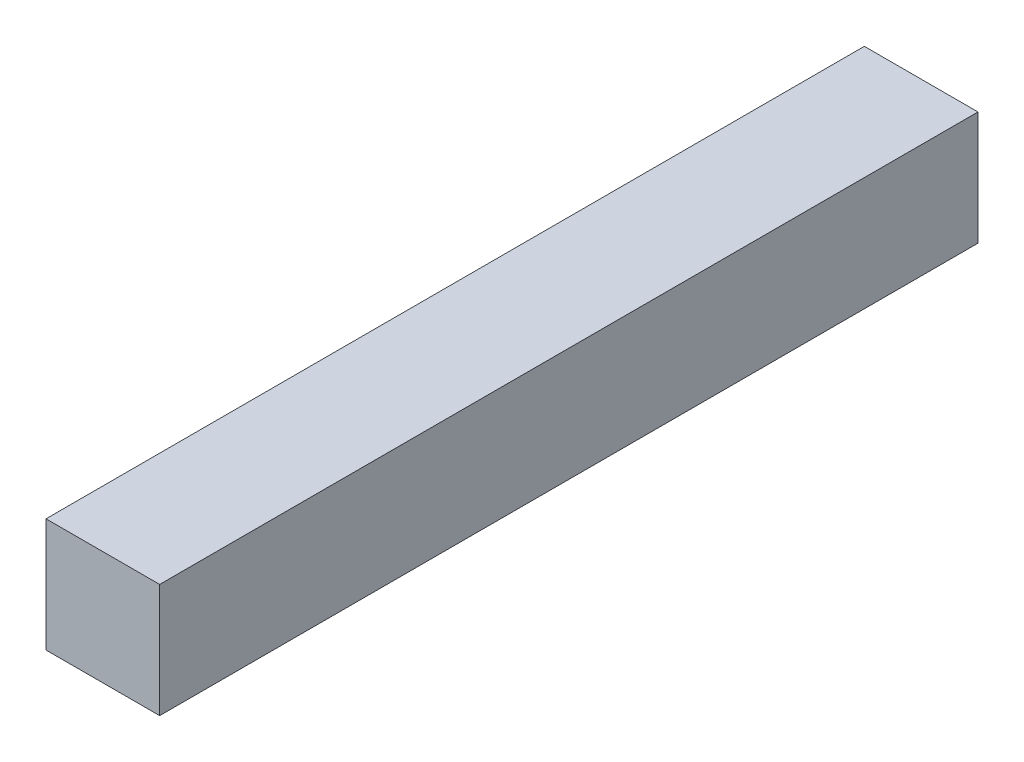
ISO-10303-21;
HEADER;
FILE_DESCRIPTION(('STEP AP214'),'2;1');
FILE_NAME('part.step','',(''),(''),'','','');
FILE_SCHEMA(('AUTOMOTIVE_DESIGN { 1 0 10303 214 1 1 1 1 }'));
ENDSEC;
DATA;
#1=APPLICATION_CONTEXT('core data for automotive mechanical design processes');
#2=APPLICATION_PROTOCOL_DEFINITION('international standard','automotive_design',2000,#1);
#3=PRODUCT_CONTEXT('',#1,'mechanical');
#4=PRODUCT('Part','Part','',(#3));
#5=PRODUCT_RELATED_PRODUCT_CATEGORY('part','',(#4));
#6=PRODUCT_DEFINITION_FORMATION('','',#4);
#7=PRODUCT_DEFINITION_CONTEXT('part definition',#1,'design');
#8=PRODUCT_DEFINITION('design','',#6,#7);
#9=PRODUCT_DEFINITION_SHAPE('','',#8);
#10=(LENGTH_UNIT() NAMED_UNIT(*) SI_UNIT(.MILLI.,.METRE.));
#11=(NAMED_UNIT(*) PLANE_ANGLE_UNIT() SI_UNIT($,.RADIAN.));
#12=(NAMED_UNIT(*) SI_UNIT($,.STERADIAN.) SOLID_ANGLE_UNIT());
#13=UNCERTAINTY_MEASURE_WITH_UNIT(LENGTH_MEASURE(1.E-05),#10,'distance_accuracy_value','');
#14=(GEOMETRIC_REPRESENTATION_CONTEXT(3) GLOBAL_UNCERTAINTY_ASSIGNED_CONTEXT((#13)) GLOBAL_UNIT_ASSIGNED_CONTEXT((#10,
#11,#12)) REPRESENTATION_CONTEXT('',''));
#15=CARTESIAN_POINT('',(0.,0.,0.));
#16=DIRECTION('',(0.,0.,1.));
#17=DIRECTION('',(1.,0.,0.));
#18=AXIS2_PLACEMENT_3D('',#15,#16,#17);
#19=CARTESIAN_POINT('',(2.5,-2.5,36.));
#20=DIRECTION('',(-1.,0.,0.));
#21=DIRECTION('',(0.,0.,1.));
#22=AXIS2_PLACEMENT_3D('',#19,#20,#21);
#23=PLANE('',#22);
#24=DIRECTION('',(0.,1.,0.));
#25=VECTOR('',#24,1.);
#26=CARTESIAN_POINT('',(2.5,-2.5,0.));
#27=LINE('',#26,#25);
#28=CARTESIAN_POINT('',(2.5,-2.5,0.));
#29=VERTEX_POINT('',#28);
#30=CARTESIAN_POINT('',(2.5,2.5,0.));
#31=VERTEX_POINT('',#30);
#32=EDGE_CURVE('E99',#29,#31,#27,.T.);
#33=ORIENTED_EDGE('',*,*,#32,.T.);
#34=DIRECTION('',(0.,0.,-1.));
#35=VECTOR('',#34,1.);
#36=CARTESIAN_POINT('',(2.5,2.5,36.));
#37=LINE('',#36,#35);
#38=CARTESIAN_POINT('',(2.5,2.5,36.));
#39=VERTEX_POINT('',#38);
#40=EDGE_CURVE('E11',#39,#31,#37,.T.);
#41=ORIENTED_EDGE('',*,*,#40,.F.);
#42=DIRECTION('',(0.,1.,0.));
#43=VECTOR('',#42,1.);
#44=CARTESIAN_POINT('',(2.5,-2.5,36.));
#45=LINE('',#44,#43);
#46=CARTESIAN_POINT('',(2.5,-2.5,36.));
#47=VERTEX_POINT('',#46);
#48=EDGE_CURVE('E87',#47,#39,#45,.T.);
#49=ORIENTED_EDGE('',*,*,#48,.F.);
#50=DIRECTION('',(0.,0.,-1.));
#51=VECTOR('',#50,1.);
#52=CARTESIAN_POINT('',(2.5,-2.5,36.));
#53=LINE('',#52,#51);
#54=EDGE_CURVE('E95',#47,#29,#53,.T.);
#55=ORIENTED_EDGE('',*,*,#54,.T.);
#56=EDGE_LOOP('',(#33,#41,#49,#55));
#57=FACE_BOUND('',#56,.T.);
#58=ADVANCED_FACE('F36',(#57),#23,.F.);
#59=CARTESIAN_POINT('',(-2.5,2.5,36.));
#60=DIRECTION('',(0.,-1.,0.));
#61=DIRECTION('',(0.,0.,-1.));
#62=AXIS2_PLACEMENT_3D('',#59,#60,#61);
#63=PLANE('',#62);
#64=DIRECTION('',(-1.,0.,0.));
#65=VECTOR('',#64,1.);
#66=CARTESIAN_POINT('',(-2.5,2.5,0.));
#67=LINE('',#66,#65);
#68=CARTESIAN_POINT('',(-2.5,2.5,0.));
#69=VERTEX_POINT('',#68);
#70=EDGE_CURVE('E91',#31,#69,#67,.T.);
#71=ORIENTED_EDGE('',*,*,#70,.T.);
#72=DIRECTION('',(0.,0.,-1.));
#73=VECTOR('',#72,1.);
#74=CARTESIAN_POINT('',(-2.5,2.5,36.));
#75=LINE('',#74,#73);
#76=CARTESIAN_POINT('',(-2.5,2.5,36.));
#77=VERTEX_POINT('',#76);
#78=EDGE_CURVE('E44',#77,#69,#75,.T.);
#79=ORIENTED_EDGE('',*,*,#78,.F.);
#80=DIRECTION('',(-1.,0.,0.));
#81=VECTOR('',#80,1.);
#82=CARTESIAN_POINT('',(-2.5,2.5,36.));
#83=LINE('',#82,#81);
#84=EDGE_CURVE('E82',#39,#77,#83,.T.);
#85=ORIENTED_EDGE('',*,*,#84,.F.);
#86=ORIENTED_EDGE('',*,*,#40,.T.);
#87=EDGE_LOOP('',(#71,#79,#85,#86));
#88=FACE_BOUND('',#87,.T.);
#89=ADVANCED_FACE('F90',(#88),#63,.F.);
#90=CARTESIAN_POINT('',(-2.5,-2.5,36.));
#91=DIRECTION('',(1.,0.,0.));
#92=DIRECTION('',(0.,0.,-1.));
#93=AXIS2_PLACEMENT_3D('',#90,#91,#92);
#94=PLANE('',#93);
#95=DIRECTION('',(0.,-1.,0.));
#96=VECTOR('',#95,1.);
#97=CARTESIAN_POINT('',(-2.5,-2.5,0.));
#98=LINE('',#97,#96);
#99=CARTESIAN_POINT('',(-2.5,-2.5,0.));
#100=VERTEX_POINT('',#99);
#101=EDGE_CURVE('E69',#69,#100,#98,.T.);
#102=ORIENTED_EDGE('',*,*,#101,.T.);
#103=DIRECTION('',(0.,0.,-1.));
#104=VECTOR('',#103,1.);
#105=CARTESIAN_POINT('',(-2.5,-2.5,36.));
#106=LINE('',#105,#104);
#107=CARTESIAN_POINT('',(-2.5,-2.5,36.));
#108=VERTEX_POINT('',#107);
#109=EDGE_CURVE('E92',#108,#100,#106,.T.);
#110=ORIENTED_EDGE('',*,*,#109,.F.);
#111=DIRECTION('',(0.,-1.,0.));
#112=VECTOR('',#111,1.);
#113=CARTESIAN_POINT('',(-2.5,-2.5,36.));
#114=LINE('',#113,#112);
#115=EDGE_CURVE('E85',#77,#108,#114,.T.);
#116=ORIENTED_EDGE('',*,*,#115,.F.);
#117=ORIENTED_EDGE('',*,*,#78,.T.);
#118=EDGE_LOOP('',(#102,#110,#116,#117));
#119=FACE_BOUND('',#118,.T.);
#120=ADVANCED_FACE('F93',(#119),#94,.F.);
#121=CARTESIAN_POINT('',(-2.5,-2.5,36.));
#122=DIRECTION('',(0.,1.,0.));
#123=DIRECTION('',(0.,0.,1.));
#124=AXIS2_PLACEMENT_3D('',#121,#122,#123);
#125=PLANE('',#124);
#126=DIRECTION('',(1.,0.,0.));
#127=VECTOR('',#126,1.);
#128=CARTESIAN_POINT('',(-2.5,-2.5,0.));
#129=LINE('',#128,#127);
#130=EDGE_CURVE('E75',#100,#29,#129,.T.);
#131=ORIENTED_EDGE('',*,*,#130,.T.);
#132=ORIENTED_EDGE('',*,*,#54,.F.);
#133=DIRECTION('',(1.,0.,0.));
#134=VECTOR('',#133,1.);
#135=CARTESIAN_POINT('',(-2.5,-2.5,36.));
#136=LINE('',#135,#134);
#137=EDGE_CURVE('E52',#108,#47,#136,.T.);
#138=ORIENTED_EDGE('',*,*,#137,.F.);
#139=ORIENTED_EDGE('',*,*,#109,.T.);
#140=EDGE_LOOP('',(#131,#132,#138,#139));
#141=FACE_BOUND('',#140,.T.);
#142=ADVANCED_FACE('F106',(#141),#125,.F.);
#143=CARTESIAN_POINT('',(0.,0.,36.));
#144=DIRECTION('',(0.,0.,-1.));
#145=DIRECTION('',(-1.,0.,0.));
#146=AXIS2_PLACEMENT_3D('',#143,#144,#145);
#147=PLANE('',#146);
#148=ORIENTED_EDGE('',*,*,#48,.T.);
#149=ORIENTED_EDGE('',*,*,#84,.T.);
#150=ORIENTED_EDGE('',*,*,#115,.T.);
#151=ORIENTED_EDGE('',*,*,#137,.T.);
#152=EDGE_LOOP('',(#148,#149,#150,#151));
#153=FACE_BOUND('',#152,.T.);
#154=ADVANCED_FACE('F83',(#153),#147,.F.);
#155=CARTESIAN_POINT('',(0.,0.,0.));
#156=DIRECTION('',(0.,0.,-1.));
#157=DIRECTION('',(-1.,0.,0.));
#158=AXIS2_PLACEMENT_3D('',#155,#156,#157);
#159=PLANE('',#158);
#160=ORIENTED_EDGE('',*,*,#32,.F.);
#161=ORIENTED_EDGE('',*,*,#130,.F.);
#162=ORIENTED_EDGE('',*,*,#101,.F.);
#163=ORIENTED_EDGE('',*,*,#70,.F.);
#164=EDGE_LOOP('',(#160,#161,#162,#163));
#165=FACE_BOUND('',#164,.T.);
#166=ADVANCED_FACE('F109',(#165),#159,.T.);
#167=CLOSED_SHELL('',(#58,#89,#120,#142,#154,#166));
#168=MANIFOLD_SOLID_BREP('B2',#167);
#169=ADVANCED_BREP_SHAPE_REPRESENTATION('',(#18,#168),#14);
#170=SHAPE_DEFINITION_REPRESENTATION(#9,#169);
ENDSEC;
END-ISO-10303-21;
